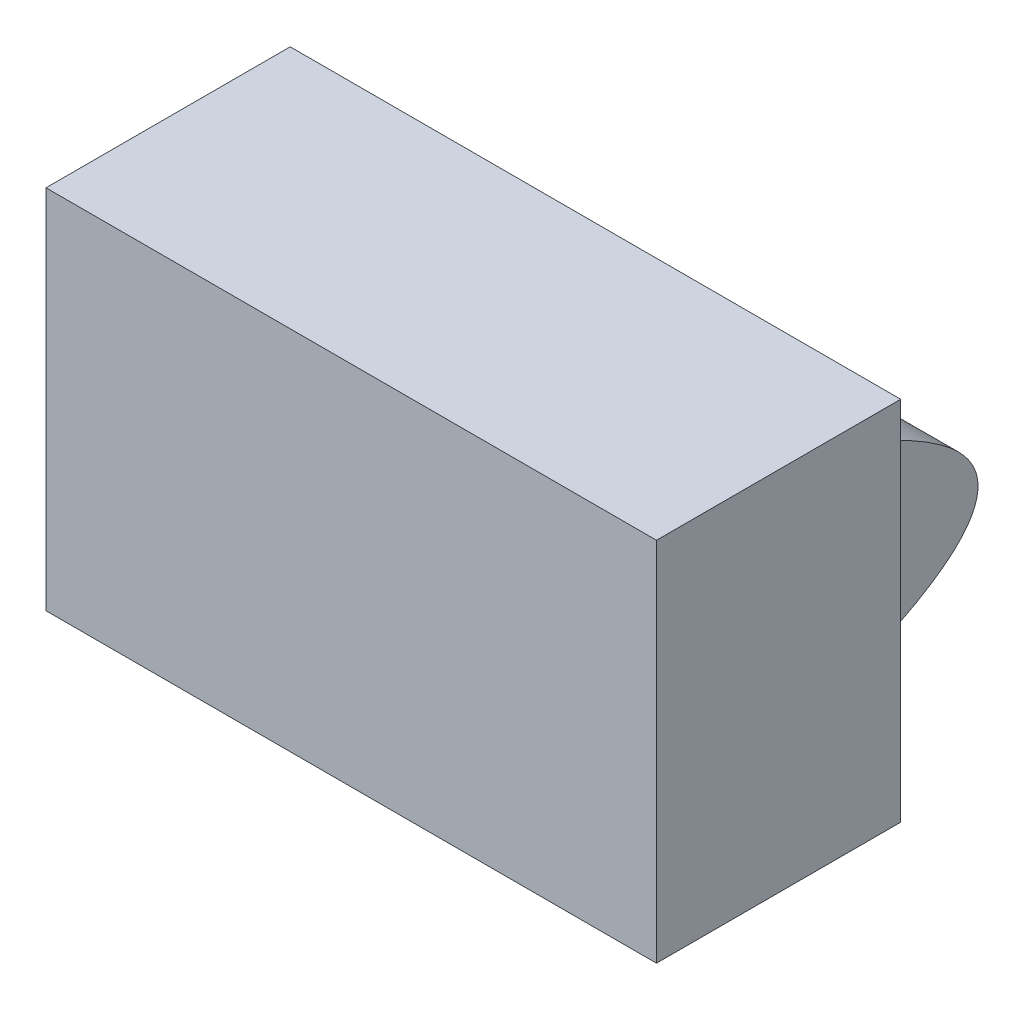
ISO-10303-21;
HEADER;
FILE_DESCRIPTION(('STEP AP214'),'2;1');
FILE_NAME('part.step','',(''),(''),'','','');
FILE_SCHEMA(('AUTOMOTIVE_DESIGN { 1 0 10303 214 1 1 1 1 }'));
ENDSEC;
DATA;
#1=APPLICATION_CONTEXT('core data for automotive mechanical design processes');
#2=APPLICATION_PROTOCOL_DEFINITION('international standard','automotive_design',2000,#1);
#3=PRODUCT_CONTEXT('',#1,'mechanical');
#4=PRODUCT('Part','Part','',(#3));
#5=PRODUCT_RELATED_PRODUCT_CATEGORY('part','',(#4));
#6=PRODUCT_DEFINITION_FORMATION('','',#4);
#7=PRODUCT_DEFINITION_CONTEXT('part definition',#1,'design');
#8=PRODUCT_DEFINITION('design','',#6,#7);
#9=PRODUCT_DEFINITION_SHAPE('','',#8);
#10=(LENGTH_UNIT() NAMED_UNIT(*) SI_UNIT(.MILLI.,.METRE.));
#11=(NAMED_UNIT(*) PLANE_ANGLE_UNIT() SI_UNIT($,.RADIAN.));
#12=(NAMED_UNIT(*) SI_UNIT($,.STERADIAN.) SOLID_ANGLE_UNIT());
#13=UNCERTAINTY_MEASURE_WITH_UNIT(LENGTH_MEASURE(1.E-05),#10,'distance_accuracy_value','');
#14=(GEOMETRIC_REPRESENTATION_CONTEXT(3) GLOBAL_UNCERTAINTY_ASSIGNED_CONTEXT((#13)) GLOBAL_UNIT_ASSIGNED_CONTEXT((#10,
#11,#12)) REPRESENTATION_CONTEXT('',''));
#15=CARTESIAN_POINT('',(0.,0.,0.));
#16=DIRECTION('',(0.,0.,1.));
#17=DIRECTION('',(1.,0.,0.));
#18=AXIS2_PLACEMENT_3D('',#15,#16,#17);
#19=CARTESIAN_POINT('',(-0.65,3.7,-4.6));
#20=DIRECTION('',(-1.,0.,0.));
#21=DIRECTION('',(0.,0.,1.));
#22=AXIS2_PLACEMENT_3D('',#19,#20,#21);
#23=PLANE('',#22);
#24=DIRECTION('',(0.,-1.,0.));
#25=VECTOR('',#24,1.);
#26=CARTESIAN_POINT('',(-0.649999999999999,3.7,-3.));
#27=LINE('',#26,#25);
#28=CARTESIAN_POINT('',(-0.649999999999999,3.7,-3.));
#29=VERTEX_POINT('',#28);
#30=CARTESIAN_POINT('',(-0.65,1.2,-3.));
#31=VERTEX_POINT('',#30);
#32=EDGE_CURVE('E163',#29,#31,#27,.T.);
#33=ORIENTED_EDGE('',*,*,#32,.T.);
#34=CARTESIAN_POINT('',(-0.65,1.2,-3.));
#35=CARTESIAN_POINT('',(-0.65,2.45,-6.2));
#36=CARTESIAN_POINT('',(-0.649999999999999,3.7,-3.));
#37=B_SPLINE_CURVE_WITH_KNOTS('',2,(#34,#35,#36),.UNSPECIFIED.,.F.,.F.,(3,3),(0.,1.),.UNSPECIFIED.);
#38=EDGE_CURVE('E149',#31,#29,#37,.T.);
#39=ORIENTED_EDGE('',*,*,#38,.T.);
#40=EDGE_LOOP('',(#33,#39));
#41=FACE_BOUND('',#40,.T.);
#42=ADVANCED_FACE('F61',(#41),#23,.F.);
#43=CARTESIAN_POINT('',(-1.85,3.7,-4.6));
#44=DIRECTION('',(1.,0.,0.));
#45=DIRECTION('',(0.,0.,-1.));
#46=AXIS2_PLACEMENT_3D('',#43,#44,#45);
#47=PLANE('',#46);
#48=CARTESIAN_POINT('',(-1.85,1.2,-3.));
#49=CARTESIAN_POINT('',(-1.85,2.45,-6.2));
#50=CARTESIAN_POINT('',(-1.85,3.7,-3.));
#51=B_SPLINE_CURVE_WITH_KNOTS('',2,(#48,#49,#50),.UNSPECIFIED.,.F.,.F.,(3,3),(0.,1.),.UNSPECIFIED.);
#52=CARTESIAN_POINT('',(-1.85,1.2,-3.));
#53=VERTEX_POINT('',#52);
#54=CARTESIAN_POINT('',(-1.85,3.7,-3.));
#55=VERTEX_POINT('',#54);
#56=EDGE_CURVE('E210',#53,#55,#51,.T.);
#57=ORIENTED_EDGE('',*,*,#56,.F.);
#58=DIRECTION('',(0.,1.,0.));
#59=VECTOR('',#58,1.);
#60=CARTESIAN_POINT('',(-1.85,3.7,-3.));
#61=LINE('',#60,#59);
#62=EDGE_CURVE('E165',#53,#55,#61,.T.);
#63=ORIENTED_EDGE('',*,*,#62,.T.);
#64=EDGE_LOOP('',(#57,#63));
#65=FACE_BOUND('',#64,.T.);
#66=ADVANCED_FACE('F286',(#65),#47,.F.);
#67=CARTESIAN_POINT('',(-3.15,3.70000000000004,-4.6));
#68=DIRECTION('',(-1.,0.,0.));
#69=DIRECTION('',(0.,0.,1.));
#70=AXIS2_PLACEMENT_3D('',#67,#68,#69);
#71=PLANE('',#70);
#72=DIRECTION('',(0.,-1.,0.));
#73=VECTOR('',#72,1.);
#74=CARTESIAN_POINT('',(-3.15,3.70000000000004,-3.));
#75=LINE('',#74,#73);
#76=CARTESIAN_POINT('',(-3.15000000000001,3.7,-3.));
#77=VERTEX_POINT('',#76);
#78=CARTESIAN_POINT('',(-3.15000000000001,1.2,-3.));
#79=VERTEX_POINT('',#78);
#80=EDGE_CURVE('E198',#77,#79,#75,.T.);
#81=ORIENTED_EDGE('',*,*,#80,.T.);
#82=CARTESIAN_POINT('',(-3.15,1.2,-3.));
#83=CARTESIAN_POINT('',(-3.15,2.45,-6.2));
#84=CARTESIAN_POINT('',(-3.15,3.7,-3.));
#85=B_SPLINE_CURVE_WITH_KNOTS('',2,(#82,#83,#84),.UNSPECIFIED.,.F.,.F.,(3,3),(0.,1.),.UNSPECIFIED.);
#86=EDGE_CURVE('E270',#77,#79,#85,.F.);
#87=ORIENTED_EDGE('',*,*,#86,.F.);
#88=EDGE_LOOP('',(#81,#87));
#89=FACE_BOUND('',#88,.T.);
#90=ADVANCED_FACE('F288',(#89),#71,.F.);
#91=CARTESIAN_POINT('',(-4.35,3.70000000000004,-4.6));
#92=DIRECTION('',(1.,0.,0.));
#93=DIRECTION('',(0.,0.,-1.));
#94=AXIS2_PLACEMENT_3D('',#91,#92,#93);
#95=PLANE('',#94);
#96=CARTESIAN_POINT('',(-4.35,1.2,-3.));
#97=CARTESIAN_POINT('',(-4.35,2.45,-6.2));
#98=CARTESIAN_POINT('',(-4.35,3.7,-3.));
#99=B_SPLINE_CURVE_WITH_KNOTS('',2,(#96,#97,#98),.UNSPECIFIED.,.F.,.F.,(3,3),(0.,1.),.UNSPECIFIED.);
#100=CARTESIAN_POINT('',(-4.35,1.2,-3.));
#101=VERTEX_POINT('',#100);
#102=CARTESIAN_POINT('',(-4.35,3.7,-3.));
#103=VERTEX_POINT('',#102);
#104=EDGE_CURVE('E249',#101,#103,#99,.T.);
#105=ORIENTED_EDGE('',*,*,#104,.F.);
#106=DIRECTION('',(0.,1.,0.));
#107=VECTOR('',#106,1.);
#108=CARTESIAN_POINT('',(-4.35,3.70000000000004,-3.));
#109=LINE('',#108,#107);
#110=EDGE_CURVE('E169',#101,#103,#109,.T.);
#111=ORIENTED_EDGE('',*,*,#110,.T.);
#112=EDGE_LOOP('',(#105,#111));
#113=FACE_BOUND('',#112,.T.);
#114=ADVANCED_FACE('F294',(#113),#95,.F.);
#115=CARTESIAN_POINT('',(-5.65,3.7,-4.6));
#116=DIRECTION('',(-1.,0.,0.));
#117=DIRECTION('',(0.,0.,1.));
#118=AXIS2_PLACEMENT_3D('',#115,#116,#117);
#119=PLANE('',#118);
#120=DIRECTION('',(0.,-1.,0.));
#121=VECTOR('',#120,1.);
#122=CARTESIAN_POINT('',(-5.65,3.7,-3.));
#123=LINE('',#122,#121);
#124=CARTESIAN_POINT('',(-5.65,3.7,-3.));
#125=VERTEX_POINT('',#124);
#126=CARTESIAN_POINT('',(-5.65,1.2,-3.));
#127=VERTEX_POINT('',#126);
#128=EDGE_CURVE('E207',#125,#127,#123,.T.);
#129=ORIENTED_EDGE('',*,*,#128,.T.);
#130=CARTESIAN_POINT('',(-5.65,1.2,-3.));
#131=CARTESIAN_POINT('',(-5.65,2.45,-6.2));
#132=CARTESIAN_POINT('',(-5.65,3.7,-3.));
#133=B_SPLINE_CURVE_WITH_KNOTS('',2,(#130,#131,#132),.UNSPECIFIED.,.F.,.F.,(3,3),(0.,1.),.UNSPECIFIED.);
#134=EDGE_CURVE('E242',#125,#127,#133,.F.);
#135=ORIENTED_EDGE('',*,*,#134,.F.);
#136=EDGE_LOOP('',(#129,#135));
#137=FACE_BOUND('',#136,.T.);
#138=ADVANCED_FACE('F318',(#137),#119,.F.);
#139=CARTESIAN_POINT('',(-6.85,3.7,-4.6));
#140=DIRECTION('',(1.,0.,0.));
#141=DIRECTION('',(0.,1.,0.));
#142=AXIS2_PLACEMENT_3D('',#139,#140,#141);
#143=PLANE('',#142);
#144=CARTESIAN_POINT('',(-6.85,1.2,-3.));
#145=CARTESIAN_POINT('',(-6.85,2.45,-6.2));
#146=CARTESIAN_POINT('',(-6.85,3.7,-3.));
#147=B_SPLINE_CURVE_WITH_KNOTS('',2,(#144,#145,#146),.UNSPECIFIED.,.F.,.F.,(3,3),(0.,1.),.UNSPECIFIED.);
#148=CARTESIAN_POINT('',(-6.85,1.2,-3.));
#149=VERTEX_POINT('',#148);
#150=CARTESIAN_POINT('',(-6.85,3.7,-3.));
#151=VERTEX_POINT('',#150);
#152=EDGE_CURVE('E159',#149,#151,#147,.T.);
#153=ORIENTED_EDGE('',*,*,#152,.F.);
#154=DIRECTION('',(0.,1.,0.));
#155=VECTOR('',#154,1.);
#156=CARTESIAN_POINT('',(-6.85,3.7,-3.));
#157=LINE('',#156,#155);
#158=EDGE_CURVE('E199',#149,#151,#157,.T.);
#159=ORIENTED_EDGE('',*,*,#158,.T.);
#160=EDGE_LOOP('',(#153,#159));
#161=FACE_BOUND('',#160,.T.);
#162=ADVANCED_FACE('F247',(#161),#143,.F.);
#163=CARTESIAN_POINT('',(0.,4.5,-3.));
#164=DIRECTION('',(0.,0.,1.));
#165=DIRECTION('',(1.,0.,0.));
#166=AXIS2_PLACEMENT_3D('',#163,#164,#165);
#167=PLANE('',#166);
#168=ORIENTED_EDGE('',*,*,#158,.F.);
#169=DIRECTION('',(-1.,0.,0.));
#170=VECTOR('',#169,1.);
#171=CARTESIAN_POINT('',(-5.65,1.2,-3.));
#172=LINE('',#171,#170);
#173=EDGE_CURVE('E204',#127,#149,#172,.T.);
#174=ORIENTED_EDGE('',*,*,#173,.F.);
#175=ORIENTED_EDGE('',*,*,#128,.F.);
#176=DIRECTION('',(1.,0.,0.));
#177=VECTOR('',#176,1.);
#178=CARTESIAN_POINT('',(-5.65,3.7,-3.));
#179=LINE('',#178,#177);
#180=EDGE_CURVE('E196',#151,#125,#179,.T.);
#181=ORIENTED_EDGE('',*,*,#180,.F.);
#182=EDGE_LOOP('',(#168,#174,#175,#181));
#183=FACE_BOUND('',#182,.T.);
#184=ORIENTED_EDGE('',*,*,#110,.F.);
#185=DIRECTION('',(-1.,0.,0.));
#186=VECTOR('',#185,1.);
#187=CARTESIAN_POINT('',(-3.15,1.2,-3.));
#188=LINE('',#187,#186);
#189=EDGE_CURVE('E217',#79,#101,#188,.T.);
#190=ORIENTED_EDGE('',*,*,#189,.F.);
#191=ORIENTED_EDGE('',*,*,#80,.F.);
#192=DIRECTION('',(1.,0.,0.));
#193=VECTOR('',#192,1.);
#194=CARTESIAN_POINT('',(-3.15,3.70000000000004,-3.));
#195=LINE('',#194,#193);
#196=EDGE_CURVE('E167',#103,#77,#195,.T.);
#197=ORIENTED_EDGE('',*,*,#196,.F.);
#198=EDGE_LOOP('',(#184,#190,#191,#197));
#199=FACE_BOUND('',#198,.T.);
#200=ORIENTED_EDGE('',*,*,#62,.F.);
#201=DIRECTION('',(-1.,0.,0.));
#202=VECTOR('',#201,1.);
#203=CARTESIAN_POINT('',(-0.65,1.2,-3.));
#204=LINE('',#203,#202);
#205=EDGE_CURVE('E152',#31,#53,#204,.T.);
#206=ORIENTED_EDGE('',*,*,#205,.F.);
#207=ORIENTED_EDGE('',*,*,#32,.F.);
#208=DIRECTION('',(1.,0.,0.));
#209=VECTOR('',#208,1.);
#210=CARTESIAN_POINT('',(-0.649999999999999,3.7,-3.));
#211=LINE('',#210,#209);
#212=EDGE_CURVE('E155',#55,#29,#211,.T.);
#213=ORIENTED_EDGE('',*,*,#212,.F.);
#214=EDGE_LOOP('',(#200,#206,#207,#213));
#215=FACE_BOUND('',#214,.T.);
#216=DIRECTION('',(-1.,0.,0.));
#217=VECTOR('',#216,1.);
#218=CARTESIAN_POINT('',(0.,0.,-3.));
#219=LINE('',#218,#217);
#220=CARTESIAN_POINT('',(0.,0.,-3.));
#221=VERTEX_POINT('',#220);
#222=CARTESIAN_POINT('',(-7.5,0.,-3.));
#223=VERTEX_POINT('',#222);
#224=EDGE_CURVE('E187',#221,#223,#219,.T.);
#225=ORIENTED_EDGE('',*,*,#224,.T.);
#226=DIRECTION('',(0.,-1.,0.));
#227=VECTOR('',#226,1.);
#228=CARTESIAN_POINT('',(-7.5,4.5,-3.));
#229=LINE('',#228,#227);
#230=CARTESIAN_POINT('',(-7.5,4.5,-3.));
#231=VERTEX_POINT('',#230);
#232=EDGE_CURVE('E71',#231,#223,#229,.T.);
#233=ORIENTED_EDGE('',*,*,#232,.F.);
#234=DIRECTION('',(-1.,0.,0.));
#235=VECTOR('',#234,1.);
#236=CARTESIAN_POINT('',(0.,4.5,-3.));
#237=LINE('',#236,#235);
#238=CARTESIAN_POINT('',(0.,4.5,-3.));
#239=VERTEX_POINT('',#238);
#240=EDGE_CURVE('E110',#239,#231,#237,.T.);
#241=ORIENTED_EDGE('',*,*,#240,.F.);
#242=DIRECTION('',(0.,-1.,0.));
#243=VECTOR('',#242,1.);
#244=CARTESIAN_POINT('',(0.,4.5,-3.));
#245=LINE('',#244,#243);
#246=EDGE_CURVE('E12',#239,#221,#245,.T.);
#247=ORIENTED_EDGE('',*,*,#246,.T.);
#248=EDGE_LOOP('',(#225,#233,#241,#247));
#249=FACE_BOUND('',#248,.T.);
#250=ADVANCED_FACE('F162',(#183,#199,#215,#249),#167,.F.);
#251=CARTESIAN_POINT('',(0.,4.5,0.));
#252=DIRECTION('',(-1.,0.,0.));
#253=DIRECTION('',(0.,0.,1.));
#254=AXIS2_PLACEMENT_3D('',#251,#252,#253);
#255=PLANE('',#254);
#256=DIRECTION('',(0.,0.,-1.));
#257=VECTOR('',#256,1.);
#258=CARTESIAN_POINT('',(0.,0.,0.));
#259=LINE('',#258,#257);
#260=CARTESIAN_POINT('',(0.,0.,0.));
#261=VERTEX_POINT('',#260);
#262=EDGE_CURVE('E184',#261,#221,#259,.T.);
#263=ORIENTED_EDGE('',*,*,#262,.T.);
#264=ORIENTED_EDGE('',*,*,#246,.F.);
#265=DIRECTION('',(0.,0.,-1.));
#266=VECTOR('',#265,1.);
#267=CARTESIAN_POINT('',(0.,4.5,0.));
#268=LINE('',#267,#266);
#269=CARTESIAN_POINT('',(0.,4.5,0.));
#270=VERTEX_POINT('',#269);
#271=EDGE_CURVE('E177',#270,#239,#268,.T.);
#272=ORIENTED_EDGE('',*,*,#271,.F.);
#273=DIRECTION('',(0.,-1.,0.));
#274=VECTOR('',#273,1.);
#275=CARTESIAN_POINT('',(0.,4.5,0.));
#276=LINE('',#275,#274);
#277=EDGE_CURVE('E183',#270,#261,#276,.T.);
#278=ORIENTED_EDGE('',*,*,#277,.T.);
#279=EDGE_LOOP('',(#263,#264,#272,#278));
#280=FACE_BOUND('',#279,.T.);
#281=ADVANCED_FACE('F63',(#280),#255,.F.);
#282=CARTESIAN_POINT('',(-7.5,4.5,0.));
#283=DIRECTION('',(1.,0.,0.));
#284=DIRECTION('',(0.,0.,-1.));
#285=AXIS2_PLACEMENT_3D('',#282,#283,#284);
#286=PLANE('',#285);
#287=DIRECTION('',(0.,0.,1.));
#288=VECTOR('',#287,1.);
#289=CARTESIAN_POINT('',(-7.5,0.,0.));
#290=LINE('',#289,#288);
#291=CARTESIAN_POINT('',(-7.5,0.,0.));
#292=VERTEX_POINT('',#291);
#293=EDGE_CURVE('E97',#223,#292,#290,.T.);
#294=ORIENTED_EDGE('',*,*,#293,.T.);
#295=DIRECTION('',(0.,-1.,0.));
#296=VECTOR('',#295,1.);
#297=CARTESIAN_POINT('',(-7.5,4.5,0.));
#298=LINE('',#297,#296);
#299=CARTESIAN_POINT('',(-7.5,4.5,0.));
#300=VERTEX_POINT('',#299);
#301=EDGE_CURVE('E193',#300,#292,#298,.T.);
#302=ORIENTED_EDGE('',*,*,#301,.F.);
#303=DIRECTION('',(0.,0.,1.));
#304=VECTOR('',#303,1.);
#305=CARTESIAN_POINT('',(-7.5,4.5,0.));
#306=LINE('',#305,#304);
#307=EDGE_CURVE('E180',#231,#300,#306,.T.);
#308=ORIENTED_EDGE('',*,*,#307,.F.);
#309=ORIENTED_EDGE('',*,*,#232,.T.);
#310=EDGE_LOOP('',(#294,#302,#308,#309));
#311=FACE_BOUND('',#310,.T.);
#312=ADVANCED_FACE('F310',(#311),#286,.F.);
#313=CARTESIAN_POINT('',(0.,4.5,0.));
#314=DIRECTION('',(0.,0.,-1.));
#315=DIRECTION('',(-1.,0.,0.));
#316=AXIS2_PLACEMENT_3D('',#313,#314,#315);
#317=PLANE('',#316);
#318=DIRECTION('',(1.,0.,0.));
#319=VECTOR('',#318,1.);
#320=CARTESIAN_POINT('',(0.,0.,0.));
#321=LINE('',#320,#319);
#322=EDGE_CURVE('E103',#292,#261,#321,.T.);
#323=ORIENTED_EDGE('',*,*,#322,.T.);
#324=ORIENTED_EDGE('',*,*,#277,.F.);
#325=DIRECTION('',(1.,0.,0.));
#326=VECTOR('',#325,1.);
#327=CARTESIAN_POINT('',(0.,4.5,0.));
#328=LINE('',#327,#326);
#329=EDGE_CURVE('E80',#300,#270,#328,.T.);
#330=ORIENTED_EDGE('',*,*,#329,.F.);
#331=ORIENTED_EDGE('',*,*,#301,.T.);
#332=EDGE_LOOP('',(#323,#324,#330,#331));
#333=FACE_BOUND('',#332,.T.);
#334=ADVANCED_FACE('F304',(#333),#317,.F.);
#335=CARTESIAN_POINT('',(0.,4.5,0.));
#336=DIRECTION('',(0.,1.,0.));
#337=DIRECTION('',(0.,0.,1.));
#338=AXIS2_PLACEMENT_3D('',#335,#336,#337);
#339=PLANE('',#338);
#340=ORIENTED_EDGE('',*,*,#271,.T.);
#341=ORIENTED_EDGE('',*,*,#240,.T.);
#342=ORIENTED_EDGE('',*,*,#307,.T.);
#343=ORIENTED_EDGE('',*,*,#329,.T.);
#344=EDGE_LOOP('',(#340,#341,#342,#343));
#345=FACE_BOUND('',#344,.T.);
#346=ADVANCED_FACE('F300',(#345),#339,.T.);
#347=CARTESIAN_POINT('',(0.,0.,0.));
#348=DIRECTION('',(0.,1.,0.));
#349=DIRECTION('',(0.,0.,1.));
#350=AXIS2_PLACEMENT_3D('',#347,#348,#349);
#351=PLANE('',#350);
#352=ORIENTED_EDGE('',*,*,#262,.F.);
#353=ORIENTED_EDGE('',*,*,#322,.F.);
#354=ORIENTED_EDGE('',*,*,#293,.F.);
#355=ORIENTED_EDGE('',*,*,#224,.F.);
#356=EDGE_LOOP('',(#352,#353,#354,#355));
#357=FACE_BOUND('',#356,.T.);
#358=ADVANCED_FACE('F303',(#357),#351,.F.);
#359=CARTESIAN_POINT('',(-7.5,1.2,-3.));
#360=CARTESIAN_POINT('',(-7.5,2.45,-6.2));
#361=CARTESIAN_POINT('',(-7.5,3.7,-3.));
#362=B_SPLINE_CURVE_WITH_KNOTS('',2,(#359,#360,#361),.UNSPECIFIED.,.F.,.F.,(3,3),(0.,1.),.UNSPECIFIED.);
#363=DIRECTION('',(1.,0.,0.));
#364=VECTOR('',#363,1.);
#365=SURFACE_OF_LINEAR_EXTRUSION('',#362,#364);
#366=ORIENTED_EDGE('',*,*,#134,.T.);
#367=ORIENTED_EDGE('',*,*,#173,.T.);
#368=ORIENTED_EDGE('',*,*,#152,.T.);
#369=ORIENTED_EDGE('',*,*,#180,.T.);
#370=EDGE_LOOP('',(#366,#367,#368,#369));
#371=FACE_BOUND('',#370,.T.);
#372=ADVANCED_FACE('F239',(#371),#365,.T.);
#373=ORIENTED_EDGE('',*,*,#86,.T.);
#374=ORIENTED_EDGE('',*,*,#189,.T.);
#375=ORIENTED_EDGE('',*,*,#104,.T.);
#376=ORIENTED_EDGE('',*,*,#196,.T.);
#377=EDGE_LOOP('',(#373,#374,#375,#376));
#378=FACE_BOUND('',#377,.T.);
#379=ADVANCED_FACE('F334',(#378),#365,.T.);
#380=ORIENTED_EDGE('',*,*,#56,.T.);
#381=ORIENTED_EDGE('',*,*,#212,.T.);
#382=ORIENTED_EDGE('',*,*,#38,.F.);
#383=ORIENTED_EDGE('',*,*,#205,.T.);
#384=EDGE_LOOP('',(#380,#381,#382,#383));
#385=FACE_BOUND('',#384,.T.);
#386=ADVANCED_FACE('F151',(#385),#365,.T.);
#387=CLOSED_SHELL('',(#42,#66,#90,#114,#138,#162,#250,#281,#312,#334,#346,#358,#372,#379,#386));
#388=MANIFOLD_SOLID_BREP('B2',#387);
#389=ADVANCED_BREP_SHAPE_REPRESENTATION('',(#18,#388),#14);
#390=SHAPE_DEFINITION_REPRESENTATION(#9,#389);
ENDSEC;
END-ISO-10303-21;
